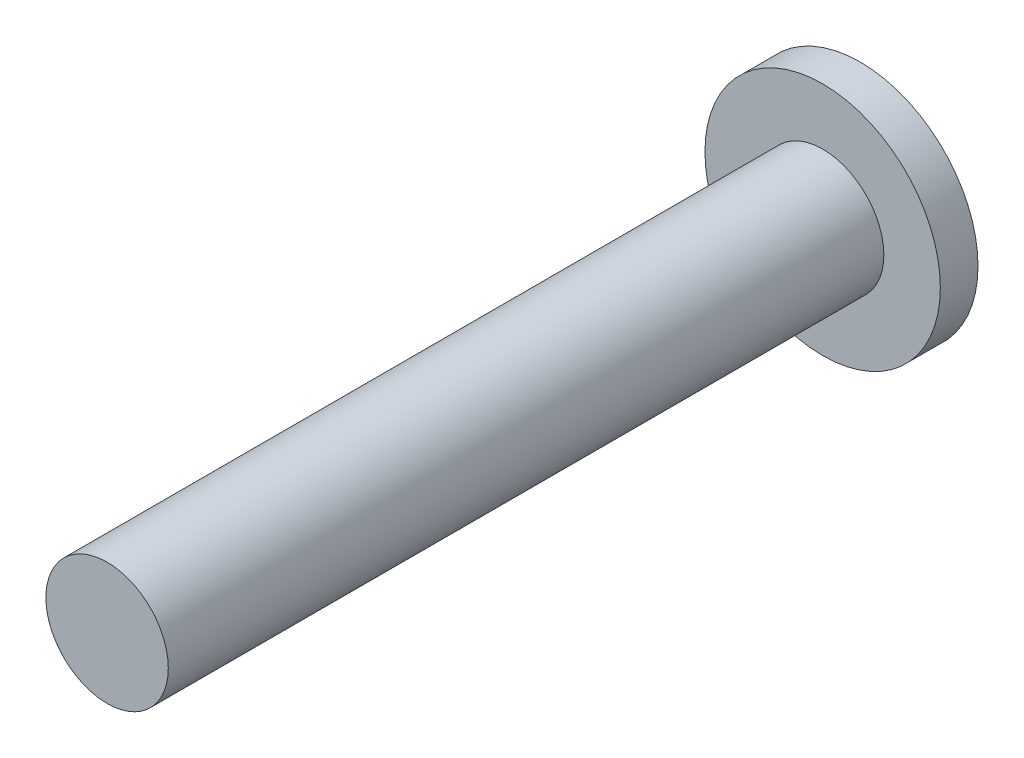
ISO-10303-21;
HEADER;
FILE_DESCRIPTION(('STEP AP214'),'2;1');
FILE_NAME('part.step','',(''),(''),'','','');
FILE_SCHEMA(('AUTOMOTIVE_DESIGN { 1 0 10303 214 1 1 1 1 }'));
ENDSEC;
DATA;
#1=APPLICATION_CONTEXT('core data for automotive mechanical design processes');
#2=APPLICATION_PROTOCOL_DEFINITION('international standard','automotive_design',2000,#1);
#3=PRODUCT_CONTEXT('',#1,'mechanical');
#4=PRODUCT('Part','Part','',(#3));
#5=PRODUCT_RELATED_PRODUCT_CATEGORY('part','',(#4));
#6=PRODUCT_DEFINITION_FORMATION('','',#4);
#7=PRODUCT_DEFINITION_CONTEXT('part definition',#1,'design');
#8=PRODUCT_DEFINITION('design','',#6,#7);
#9=PRODUCT_DEFINITION_SHAPE('','',#8);
#10=(LENGTH_UNIT() NAMED_UNIT(*) SI_UNIT(.MILLI.,.METRE.));
#11=(NAMED_UNIT(*) PLANE_ANGLE_UNIT() SI_UNIT($,.RADIAN.));
#12=(NAMED_UNIT(*) SI_UNIT($,.STERADIAN.) SOLID_ANGLE_UNIT());
#13=UNCERTAINTY_MEASURE_WITH_UNIT(LENGTH_MEASURE(1.E-05),#10,'distance_accuracy_value','');
#14=(GEOMETRIC_REPRESENTATION_CONTEXT(3) GLOBAL_UNCERTAINTY_ASSIGNED_CONTEXT((#13)) GLOBAL_UNIT_ASSIGNED_CONTEXT((#10,
#11,#12)) REPRESENTATION_CONTEXT('',''));
#15=CARTESIAN_POINT('',(0.,0.,0.));
#16=DIRECTION('',(0.,0.,1.));
#17=DIRECTION('',(1.,0.,0.));
#18=AXIS2_PLACEMENT_3D('',#15,#16,#17);
#19=CARTESIAN_POINT('',(0.,0.,4.));
#20=DIRECTION('',(0.,0.,-1.));
#21=DIRECTION('',(-1.,0.,0.));
#22=AXIS2_PLACEMENT_3D('',#19,#20,#21);
#23=CYLINDRICAL_SURFACE('',#22,12.5);
#24=CARTESIAN_POINT('',(0.,0.,4.));
#25=DIRECTION('',(0.,0.,1.));
#26=DIRECTION('',(1.,0.,0.));
#27=AXIS2_PLACEMENT_3D('',#24,#25,#26);
#28=CIRCLE('',#27,12.5);
#29=CARTESIAN_POINT('',(12.5,0.,4.));
#30=VERTEX_POINT('',#29);
#31=EDGE_CURVE('E10',#30,#30,#28,.T.);
#32=ORIENTED_EDGE('',*,*,#31,.F.);
#33=EDGE_LOOP('',(#32));
#34=FACE_BOUND('',#33,.T.);
#35=CARTESIAN_POINT('',(0.,0.,0.));
#36=DIRECTION('',(0.,0.,1.));
#37=DIRECTION('',(1.,0.,0.));
#38=AXIS2_PLACEMENT_3D('',#35,#36,#37);
#39=CIRCLE('',#38,12.5);
#40=CARTESIAN_POINT('',(12.5,0.,0.));
#41=VERTEX_POINT('',#40);
#42=EDGE_CURVE('E36',#41,#41,#39,.T.);
#43=ORIENTED_EDGE('',*,*,#42,.T.);
#44=EDGE_LOOP('',(#43));
#45=FACE_BOUND('',#44,.T.);
#46=ADVANCED_FACE('F33',(#34,#45),#23,.T.);
#47=CARTESIAN_POINT('',(0.,0.,4.));
#48=DIRECTION('',(0.,0.,1.));
#49=DIRECTION('',(1.,0.,0.));
#50=AXIS2_PLACEMENT_3D('',#47,#48,#49);
#51=PLANE('',#50);
#52=CARTESIAN_POINT('',(0.,0.,4.));
#53=DIRECTION('',(0.,0.,1.));
#54=DIRECTION('',(1.,0.,0.));
#55=AXIS2_PLACEMENT_3D('',#52,#53,#54);
#56=CIRCLE('',#55,6.5);
#57=CARTESIAN_POINT('',(6.5,0.,4.));
#58=VERTEX_POINT('',#57);
#59=EDGE_CURVE('E43',#58,#58,#56,.F.);
#60=ORIENTED_EDGE('',*,*,#59,.T.);
#61=EDGE_LOOP('',(#60));
#62=FACE_BOUND('',#61,.T.);
#63=ORIENTED_EDGE('',*,*,#31,.T.);
#64=EDGE_LOOP('',(#63));
#65=FACE_BOUND('',#64,.T.);
#66=ADVANCED_FACE('F63',(#62,#65),#51,.T.);
#67=CARTESIAN_POINT('',(0.,0.,0.));
#68=DIRECTION('',(0.,0.,1.));
#69=DIRECTION('',(1.,0.,0.));
#70=AXIS2_PLACEMENT_3D('',#67,#68,#69);
#71=PLANE('',#70);
#72=ORIENTED_EDGE('',*,*,#42,.F.);
#73=EDGE_LOOP('',(#72));
#74=FACE_BOUND('',#73,.T.);
#75=ADVANCED_FACE('F55',(#74),#71,.F.);
#76=CARTESIAN_POINT('',(0.,0.,80.));
#77=DIRECTION('',(0.,0.,-1.));
#78=DIRECTION('',(-1.,0.,0.));
#79=AXIS2_PLACEMENT_3D('',#76,#77,#78);
#80=CYLINDRICAL_SURFACE('',#79,6.5);
#81=ORIENTED_EDGE('',*,*,#59,.F.);
#82=EDGE_LOOP('',(#81));
#83=FACE_BOUND('',#82,.T.);
#84=CARTESIAN_POINT('',(0.,0.,80.));
#85=DIRECTION('',(0.,0.,1.));
#86=DIRECTION('',(1.,0.,0.));
#87=AXIS2_PLACEMENT_3D('',#84,#85,#86);
#88=CIRCLE('',#87,6.5);
#89=CARTESIAN_POINT('',(6.5,0.,80.));
#90=VERTEX_POINT('',#89);
#91=EDGE_CURVE('E47',#90,#90,#88,.T.);
#92=ORIENTED_EDGE('',*,*,#91,.F.);
#93=EDGE_LOOP('',(#92));
#94=FACE_BOUND('',#93,.T.);
#95=ADVANCED_FACE('F53',(#83,#94),#80,.T.);
#96=CARTESIAN_POINT('',(0.,0.,80.));
#97=DIRECTION('',(0.,0.,1.));
#98=DIRECTION('',(1.,0.,0.));
#99=AXIS2_PLACEMENT_3D('',#96,#97,#98);
#100=PLANE('',#99);
#101=ORIENTED_EDGE('',*,*,#91,.T.);
#102=EDGE_LOOP('',(#101));
#103=FACE_BOUND('',#102,.T.);
#104=ADVANCED_FACE('F51',(#103),#100,.T.);
#105=CLOSED_SHELL('',(#46,#66,#75,#95,#104));
#106=MANIFOLD_SOLID_BREP('B2',#105);
#107=ADVANCED_BREP_SHAPE_REPRESENTATION('',(#18,#106),#14);
#108=SHAPE_DEFINITION_REPRESENTATION(#9,#107);
ENDSEC;
END-ISO-10303-21;
